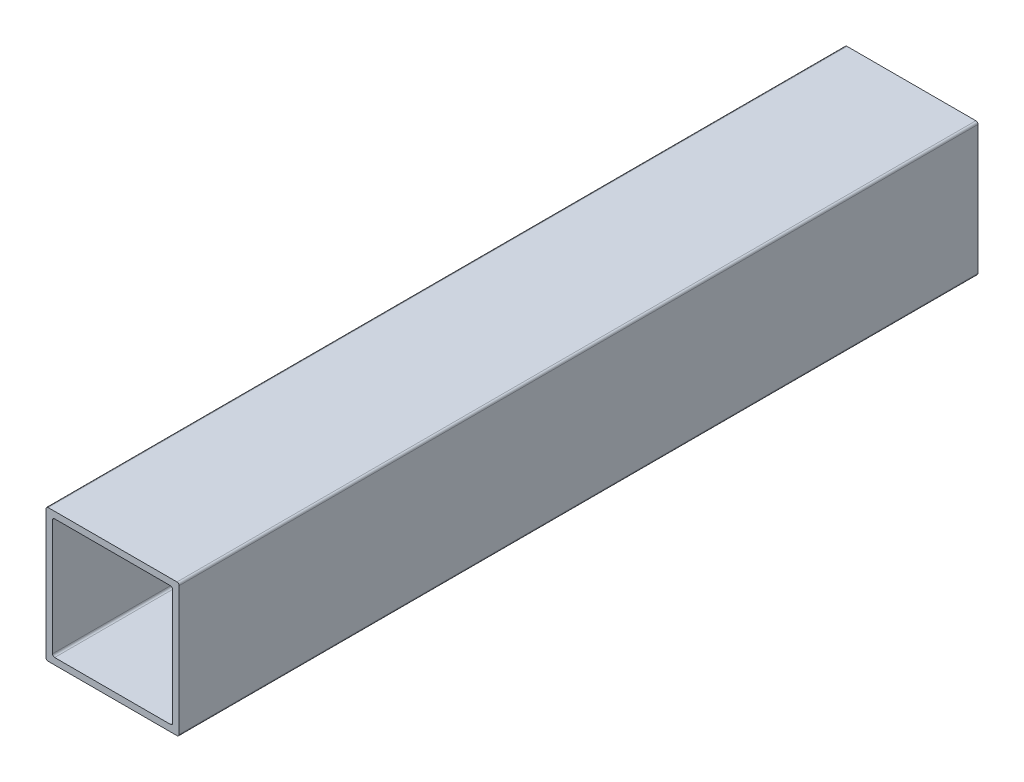
ISO-10303-21;
HEADER;
FILE_DESCRIPTION(('STEP AP214'),'2;1');
FILE_NAME('part.step','',(''),(''),'','','');
FILE_SCHEMA(('AUTOMOTIVE_DESIGN { 1 0 10303 214 1 1 1 1 }'));
ENDSEC;
DATA;
#1=APPLICATION_CONTEXT('core data for automotive mechanical design processes');
#2=APPLICATION_PROTOCOL_DEFINITION('international standard','automotive_design',2000,#1);
#3=PRODUCT_CONTEXT('',#1,'mechanical');
#4=PRODUCT('Part','Part','',(#3));
#5=PRODUCT_RELATED_PRODUCT_CATEGORY('part','',(#4));
#6=PRODUCT_DEFINITION_FORMATION('','',#4);
#7=PRODUCT_DEFINITION_CONTEXT('part definition',#1,'design');
#8=PRODUCT_DEFINITION('design','',#6,#7);
#9=PRODUCT_DEFINITION_SHAPE('','',#8);
#10=(LENGTH_UNIT() NAMED_UNIT(*) SI_UNIT(.MILLI.,.METRE.));
#11=(NAMED_UNIT(*) PLANE_ANGLE_UNIT() SI_UNIT($,.RADIAN.));
#12=(NAMED_UNIT(*) SI_UNIT($,.STERADIAN.) SOLID_ANGLE_UNIT());
#13=UNCERTAINTY_MEASURE_WITH_UNIT(LENGTH_MEASURE(1.E-05),#10,'distance_accuracy_value','');
#14=(GEOMETRIC_REPRESENTATION_CONTEXT(3) GLOBAL_UNCERTAINTY_ASSIGNED_CONTEXT((#13)) GLOBAL_UNIT_ASSIGNED_CONTEXT((#10,
#11,#12)) REPRESENTATION_CONTEXT('',''));
#15=CARTESIAN_POINT('',(0.,0.,0.));
#16=DIRECTION('',(0.,0.,1.));
#17=DIRECTION('',(1.,0.,0.));
#18=AXIS2_PLACEMENT_3D('',#15,#16,#17);
#19=CARTESIAN_POINT('',(0.,0.,-152.4));
#20=DIRECTION('',(-1.,0.,0.));
#21=DIRECTION('',(0.,0.,1.));
#22=AXIS2_PLACEMENT_3D('',#19,#20,#21);
#23=PLANE('',#22);
#24=DIRECTION('',(0.,-1.,0.));
#25=VECTOR('',#24,1.);
#26=CARTESIAN_POINT('',(0.,0.,-152.4));
#27=LINE('',#26,#25);
#28=CARTESIAN_POINT('',(0.,24.9936,-152.4));
#29=VERTEX_POINT('',#28);
#30=CARTESIAN_POINT('',(0.,0.4064,-152.4));
#31=VERTEX_POINT('',#30);
#32=EDGE_CURVE('E323',#29,#31,#27,.T.);
#33=ORIENTED_EDGE('',*,*,#32,.T.);
#34=DIRECTION('',(0.,0.,1.));
#35=VECTOR('',#34,1.);
#36=CARTESIAN_POINT('',(0.,0.4064,-152.4));
#37=LINE('',#36,#35);
#38=CARTESIAN_POINT('',(0.,0.4064,0.));
#39=VERTEX_POINT('',#38);
#40=EDGE_CURVE('E179',#31,#39,#37,.T.);
#41=ORIENTED_EDGE('',*,*,#40,.T.);
#42=DIRECTION('',(0.,-1.,0.));
#43=VECTOR('',#42,1.);
#44=CARTESIAN_POINT('',(0.,0.,0.));
#45=LINE('',#44,#43);
#46=CARTESIAN_POINT('',(0.,24.9936,0.));
#47=VERTEX_POINT('',#46);
#48=EDGE_CURVE('E162',#47,#39,#45,.T.);
#49=ORIENTED_EDGE('',*,*,#48,.F.);
#50=DIRECTION('',(0.,0.,1.));
#51=VECTOR('',#50,1.);
#52=CARTESIAN_POINT('',(0.,24.9936,-152.4));
#53=LINE('',#52,#51);
#54=EDGE_CURVE('E176',#47,#29,#53,.F.);
#55=ORIENTED_EDGE('',*,*,#54,.T.);
#56=EDGE_LOOP('',(#33,#41,#49,#55));
#57=FACE_BOUND('',#56,.T.);
#58=ADVANCED_FACE('F45',(#57),#23,.T.);
#59=CARTESIAN_POINT('',(0.,25.4,-152.4));
#60=DIRECTION('',(0.,1.,0.));
#61=DIRECTION('',(0.,0.,1.));
#62=AXIS2_PLACEMENT_3D('',#59,#60,#61);
#63=PLANE('',#62);
#64=DIRECTION('',(-1.,0.,0.));
#65=VECTOR('',#64,1.);
#66=CARTESIAN_POINT('',(0.,25.4,-152.4));
#67=LINE('',#66,#65);
#68=CARTESIAN_POINT('',(24.9936,25.4,-152.4));
#69=VERTEX_POINT('',#68);
#70=CARTESIAN_POINT('',(0.4064,25.4,-152.4));
#71=VERTEX_POINT('',#70);
#72=EDGE_CURVE('E188',#69,#71,#67,.T.);
#73=ORIENTED_EDGE('',*,*,#72,.T.);
#74=DIRECTION('',(0.,0.,1.));
#75=VECTOR('',#74,1.);
#76=CARTESIAN_POINT('',(0.4064,25.4,-152.4));
#77=LINE('',#76,#75);
#78=CARTESIAN_POINT('',(0.4064,25.4,0.));
#79=VERTEX_POINT('',#78);
#80=EDGE_CURVE('E234',#71,#79,#77,.T.);
#81=ORIENTED_EDGE('',*,*,#80,.T.);
#82=DIRECTION('',(-1.,0.,0.));
#83=VECTOR('',#82,1.);
#84=CARTESIAN_POINT('',(0.,25.4,0.));
#85=LINE('',#84,#83);
#86=CARTESIAN_POINT('',(24.9936,25.4,0.));
#87=VERTEX_POINT('',#86);
#88=EDGE_CURVE('E164',#87,#79,#85,.T.);
#89=ORIENTED_EDGE('',*,*,#88,.F.);
#90=DIRECTION('',(0.,0.,1.));
#91=VECTOR('',#90,1.);
#92=CARTESIAN_POINT('',(24.9936,25.4,-152.4));
#93=LINE('',#92,#91);
#94=EDGE_CURVE('E231',#87,#69,#93,.F.);
#95=ORIENTED_EDGE('',*,*,#94,.T.);
#96=EDGE_LOOP('',(#73,#81,#89,#95));
#97=FACE_BOUND('',#96,.T.);
#98=ADVANCED_FACE('F362',(#97),#63,.T.);
#99=CARTESIAN_POINT('',(25.4,0.,-152.4));
#100=DIRECTION('',(1.,0.,0.));
#101=DIRECTION('',(0.,0.,-1.));
#102=AXIS2_PLACEMENT_3D('',#99,#100,#101);
#103=PLANE('',#102);
#104=DIRECTION('',(0.,1.,0.));
#105=VECTOR('',#104,1.);
#106=CARTESIAN_POINT('',(25.4,0.,0.));
#107=LINE('',#106,#105);
#108=CARTESIAN_POINT('',(25.4,0.4064,0.));
#109=VERTEX_POINT('',#108);
#110=CARTESIAN_POINT('',(25.4,24.9936,0.));
#111=VERTEX_POINT('',#110);
#112=EDGE_CURVE('E335',#109,#111,#107,.T.);
#113=ORIENTED_EDGE('',*,*,#112,.F.);
#114=DIRECTION('',(0.,0.,1.));
#115=VECTOR('',#114,1.);
#116=CARTESIAN_POINT('',(25.4,0.4064,-152.4));
#117=LINE('',#116,#115);
#118=CARTESIAN_POINT('',(25.4,0.4064,-152.4));
#119=VERTEX_POINT('',#118);
#120=EDGE_CURVE('E228',#109,#119,#117,.F.);
#121=ORIENTED_EDGE('',*,*,#120,.T.);
#122=DIRECTION('',(0.,1.,0.));
#123=VECTOR('',#122,1.);
#124=CARTESIAN_POINT('',(25.4,0.,-152.4));
#125=LINE('',#124,#123);
#126=CARTESIAN_POINT('',(25.4,24.9936,-152.4));
#127=VERTEX_POINT('',#126);
#128=EDGE_CURVE('E194',#119,#127,#125,.T.);
#129=ORIENTED_EDGE('',*,*,#128,.T.);
#130=DIRECTION('',(0.,0.,1.));
#131=VECTOR('',#130,1.);
#132=CARTESIAN_POINT('',(25.4,24.9936,-152.4));
#133=LINE('',#132,#131);
#134=EDGE_CURVE('E224',#127,#111,#133,.T.);
#135=ORIENTED_EDGE('',*,*,#134,.T.);
#136=EDGE_LOOP('',(#113,#121,#129,#135));
#137=FACE_BOUND('',#136,.T.);
#138=ADVANCED_FACE('F342',(#137),#103,.T.);
#139=CARTESIAN_POINT('',(0.,0.,-152.4));
#140=DIRECTION('',(0.,-1.,0.));
#141=DIRECTION('',(0.,0.,-1.));
#142=AXIS2_PLACEMENT_3D('',#139,#140,#141);
#143=PLANE('',#142);
#144=DIRECTION('',(1.,0.,0.));
#145=VECTOR('',#144,1.);
#146=CARTESIAN_POINT('',(0.,0.,0.));
#147=LINE('',#146,#145);
#148=CARTESIAN_POINT('',(0.4064,0.,0.));
#149=VERTEX_POINT('',#148);
#150=CARTESIAN_POINT('',(24.9936,0.,0.));
#151=VERTEX_POINT('',#150);
#152=EDGE_CURVE('E181',#149,#151,#147,.T.);
#153=ORIENTED_EDGE('',*,*,#152,.F.);
#154=DIRECTION('',(0.,0.,1.));
#155=VECTOR('',#154,1.);
#156=CARTESIAN_POINT('',(0.4064,0.,-152.4));
#157=LINE('',#156,#155);
#158=CARTESIAN_POINT('',(0.4064,0.,-152.4));
#159=VERTEX_POINT('',#158);
#160=EDGE_CURVE('E210',#149,#159,#157,.F.);
#161=ORIENTED_EDGE('',*,*,#160,.T.);
#162=DIRECTION('',(1.,0.,0.));
#163=VECTOR('',#162,1.);
#164=CARTESIAN_POINT('',(0.,0.,-152.4));
#165=LINE('',#164,#163);
#166=CARTESIAN_POINT('',(24.9936,0.,-152.4));
#167=VERTEX_POINT('',#166);
#168=EDGE_CURVE('E326',#159,#167,#165,.T.);
#169=ORIENTED_EDGE('',*,*,#168,.T.);
#170=DIRECTION('',(0.,0.,1.));
#171=VECTOR('',#170,1.);
#172=CARTESIAN_POINT('',(24.9936,0.,-152.4));
#173=LINE('',#172,#171);
#174=EDGE_CURVE('E206',#167,#151,#173,.T.);
#175=ORIENTED_EDGE('',*,*,#174,.T.);
#176=EDGE_LOOP('',(#153,#161,#169,#175));
#177=FACE_BOUND('',#176,.T.);
#178=ADVANCED_FACE('F355',(#177),#143,.T.);
#179=CARTESIAN_POINT('',(0.,0.,-152.4));
#180=DIRECTION('',(0.,0.,-1.));
#181=DIRECTION('',(-1.,0.,0.));
#182=AXIS2_PLACEMENT_3D('',#179,#180,#181);
#183=PLANE('',#182);
#184=DIRECTION('',(-1.,0.,0.));
#185=VECTOR('',#184,1.);
#186=CARTESIAN_POINT('',(1.2446,24.1554,-152.4));
#187=LINE('',#186,#185);
#188=CARTESIAN_POINT('',(23.749,24.1554,-152.4));
#189=VERTEX_POINT('',#188);
#190=CARTESIAN_POINT('',(1.651,24.1554,-152.4));
#191=VERTEX_POINT('',#190);
#192=EDGE_CURVE('E182',#189,#191,#187,.T.);
#193=ORIENTED_EDGE('',*,*,#192,.T.);
#194=CARTESIAN_POINT('',(1.651,23.749,-152.4));
#195=DIRECTION('',(0.,0.,-1.));
#196=DIRECTION('',(-1.,0.,0.));
#197=AXIS2_PLACEMENT_3D('',#194,#195,#196);
#198=CIRCLE('',#197,0.4064);
#199=CARTESIAN_POINT('',(1.2446,23.749,-152.4));
#200=VERTEX_POINT('',#199);
#201=EDGE_CURVE('E267',#191,#200,#198,.F.);
#202=ORIENTED_EDGE('',*,*,#201,.T.);
#203=DIRECTION('',(0.,-1.,0.));
#204=VECTOR('',#203,1.);
#205=CARTESIAN_POINT('',(1.2446,1.2446,-152.4));
#206=LINE('',#205,#204);
#207=CARTESIAN_POINT('',(1.2446,1.651,-152.4));
#208=VERTEX_POINT('',#207);
#209=EDGE_CURVE('E302',#200,#208,#206,.T.);
#210=ORIENTED_EDGE('',*,*,#209,.T.);
#211=CARTESIAN_POINT('',(1.651,1.651,-152.4));
#212=DIRECTION('',(0.,0.,-1.));
#213=DIRECTION('',(-1.,0.,0.));
#214=AXIS2_PLACEMENT_3D('',#211,#212,#213);
#215=CIRCLE('',#214,0.4064);
#216=CARTESIAN_POINT('',(1.651,1.2446,-152.4));
#217=VERTEX_POINT('',#216);
#218=EDGE_CURVE('E11',#208,#217,#215,.F.);
#219=ORIENTED_EDGE('',*,*,#218,.T.);
#220=DIRECTION('',(1.,0.,0.));
#221=VECTOR('',#220,1.);
#222=CARTESIAN_POINT('',(1.2446,1.2446,-152.4));
#223=LINE('',#222,#221);
#224=CARTESIAN_POINT('',(23.749,1.2446,-152.4));
#225=VERTEX_POINT('',#224);
#226=EDGE_CURVE('E298',#217,#225,#223,.T.);
#227=ORIENTED_EDGE('',*,*,#226,.T.);
#228=CARTESIAN_POINT('',(23.749,1.651,-152.4));
#229=DIRECTION('',(0.,0.,-1.));
#230=DIRECTION('',(-1.,0.,0.));
#231=AXIS2_PLACEMENT_3D('',#228,#229,#230);
#232=CIRCLE('',#231,0.4064);
#233=CARTESIAN_POINT('',(24.1554,1.651,-152.4));
#234=VERTEX_POINT('',#233);
#235=EDGE_CURVE('E279',#225,#234,#232,.F.);
#236=ORIENTED_EDGE('',*,*,#235,.T.);
#237=DIRECTION('',(0.,1.,0.));
#238=VECTOR('',#237,1.);
#239=CARTESIAN_POINT('',(24.1554,1.2446,-152.4));
#240=LINE('',#239,#238);
#241=CARTESIAN_POINT('',(24.1554,23.749,-152.4));
#242=VERTEX_POINT('',#241);
#243=EDGE_CURVE('E301',#234,#242,#240,.T.);
#244=ORIENTED_EDGE('',*,*,#243,.T.);
#245=CARTESIAN_POINT('',(23.749,23.749,-152.4));
#246=DIRECTION('',(0.,0.,-1.));
#247=DIRECTION('',(-1.,0.,0.));
#248=AXIS2_PLACEMENT_3D('',#245,#246,#247);
#249=CIRCLE('',#248,0.4064);
#250=EDGE_CURVE('E273',#242,#189,#249,.F.);
#251=ORIENTED_EDGE('',*,*,#250,.T.);
#252=EDGE_LOOP('',(#193,#202,#210,#219,#227,#236,#244,#251));
#253=FACE_BOUND('',#252,.T.);
#254=ORIENTED_EDGE('',*,*,#168,.F.);
#255=CARTESIAN_POINT('',(0.4064,0.4064,-152.4));
#256=DIRECTION('',(0.,0.,-1.));
#257=DIRECTION('',(-1.,0.,0.));
#258=AXIS2_PLACEMENT_3D('',#255,#256,#257);
#259=CIRCLE('',#258,0.4064);
#260=EDGE_CURVE('E221',#159,#31,#259,.T.);
#261=ORIENTED_EDGE('',*,*,#260,.T.);
#262=ORIENTED_EDGE('',*,*,#32,.F.);
#263=CARTESIAN_POINT('',(0.4064,24.9936,-152.4));
#264=DIRECTION('',(0.,0.,-1.));
#265=DIRECTION('',(-1.,0.,0.));
#266=AXIS2_PLACEMENT_3D('',#263,#264,#265);
#267=CIRCLE('',#266,0.4064);
#268=EDGE_CURVE('E186',#29,#71,#267,.T.);
#269=ORIENTED_EDGE('',*,*,#268,.T.);
#270=ORIENTED_EDGE('',*,*,#72,.F.);
#271=CARTESIAN_POINT('',(24.9936,24.9936,-152.4));
#272=DIRECTION('',(0.,0.,-1.));
#273=DIRECTION('',(-1.,0.,0.));
#274=AXIS2_PLACEMENT_3D('',#271,#272,#273);
#275=CIRCLE('',#274,0.4064);
#276=EDGE_CURVE('E213',#69,#127,#275,.T.);
#277=ORIENTED_EDGE('',*,*,#276,.T.);
#278=ORIENTED_EDGE('',*,*,#128,.F.);
#279=CARTESIAN_POINT('',(24.9936,0.4064,-152.4));
#280=DIRECTION('',(0.,0.,-1.));
#281=DIRECTION('',(-1.,0.,0.));
#282=AXIS2_PLACEMENT_3D('',#279,#280,#281);
#283=CIRCLE('',#282,0.4064);
#284=EDGE_CURVE('E218',#119,#167,#283,.T.);
#285=ORIENTED_EDGE('',*,*,#284,.T.);
#286=EDGE_LOOP('',(#254,#261,#262,#269,#270,#277,#278,#285));
#287=FACE_BOUND('',#286,.T.);
#288=ADVANCED_FACE('F351',(#253,#287),#183,.T.);
#289=CARTESIAN_POINT('',(0.,0.,0.));
#290=DIRECTION('',(0.,0.,-1.));
#291=DIRECTION('',(-1.,0.,0.));
#292=AXIS2_PLACEMENT_3D('',#289,#290,#291);
#293=PLANE('',#292);
#294=DIRECTION('',(1.,0.,0.));
#295=VECTOR('',#294,1.);
#296=CARTESIAN_POINT('',(1.2446,1.2446,0.));
#297=LINE('',#296,#295);
#298=CARTESIAN_POINT('',(1.651,1.2446,0.));
#299=VERTEX_POINT('',#298);
#300=CARTESIAN_POINT('',(23.749,1.2446,0.));
#301=VERTEX_POINT('',#300);
#302=EDGE_CURVE('E287',#299,#301,#297,.T.);
#303=ORIENTED_EDGE('',*,*,#302,.F.);
#304=CARTESIAN_POINT('',(1.651,1.651,0.));
#305=DIRECTION('',(0.,0.,-1.));
#306=DIRECTION('',(-1.,0.,0.));
#307=AXIS2_PLACEMENT_3D('',#304,#305,#306);
#308=CIRCLE('',#307,0.4064);
#309=CARTESIAN_POINT('',(1.2446,1.651,0.));
#310=VERTEX_POINT('',#309);
#311=EDGE_CURVE('E54',#299,#310,#308,.T.);
#312=ORIENTED_EDGE('',*,*,#311,.T.);
#313=DIRECTION('',(0.,-1.,0.));
#314=VECTOR('',#313,1.);
#315=CARTESIAN_POINT('',(1.2446,1.2446,0.));
#316=LINE('',#315,#314);
#317=CARTESIAN_POINT('',(1.2446,23.749,0.));
#318=VERTEX_POINT('',#317);
#319=EDGE_CURVE('E286',#318,#310,#316,.T.);
#320=ORIENTED_EDGE('',*,*,#319,.F.);
#321=CARTESIAN_POINT('',(1.651,23.749,0.));
#322=DIRECTION('',(0.,0.,-1.));
#323=DIRECTION('',(-1.,0.,0.));
#324=AXIS2_PLACEMENT_3D('',#321,#322,#323);
#325=CIRCLE('',#324,0.4064);
#326=CARTESIAN_POINT('',(1.651,24.1554,0.));
#327=VERTEX_POINT('',#326);
#328=EDGE_CURVE('E264',#318,#327,#325,.T.);
#329=ORIENTED_EDGE('',*,*,#328,.T.);
#330=DIRECTION('',(-1.,0.,0.));
#331=VECTOR('',#330,1.);
#332=CARTESIAN_POINT('',(1.2446,24.1554,0.));
#333=LINE('',#332,#331);
#334=CARTESIAN_POINT('',(23.749,24.1554,0.));
#335=VERTEX_POINT('',#334);
#336=EDGE_CURVE('E308',#335,#327,#333,.T.);
#337=ORIENTED_EDGE('',*,*,#336,.F.);
#338=CARTESIAN_POINT('',(23.749,23.749,0.));
#339=DIRECTION('',(0.,0.,-1.));
#340=DIRECTION('',(-1.,0.,0.));
#341=AXIS2_PLACEMENT_3D('',#338,#339,#340);
#342=CIRCLE('',#341,0.4064);
#343=CARTESIAN_POINT('',(24.1554,23.749,0.));
#344=VERTEX_POINT('',#343);
#345=EDGE_CURVE('E270',#335,#344,#342,.T.);
#346=ORIENTED_EDGE('',*,*,#345,.T.);
#347=DIRECTION('',(0.,1.,0.));
#348=VECTOR('',#347,1.);
#349=CARTESIAN_POINT('',(24.1554,1.2446,0.));
#350=LINE('',#349,#348);
#351=CARTESIAN_POINT('',(24.1554,1.651,0.));
#352=VERTEX_POINT('',#351);
#353=EDGE_CURVE('E316',#352,#344,#350,.T.);
#354=ORIENTED_EDGE('',*,*,#353,.F.);
#355=CARTESIAN_POINT('',(23.749,1.651,0.));
#356=DIRECTION('',(0.,0.,-1.));
#357=DIRECTION('',(-1.,0.,0.));
#358=AXIS2_PLACEMENT_3D('',#355,#356,#357);
#359=CIRCLE('',#358,0.4064);
#360=EDGE_CURVE('E276',#352,#301,#359,.T.);
#361=ORIENTED_EDGE('',*,*,#360,.T.);
#362=EDGE_LOOP('',(#303,#312,#320,#329,#337,#346,#354,#361));
#363=FACE_BOUND('',#362,.T.);
#364=ORIENTED_EDGE('',*,*,#48,.T.);
#365=CARTESIAN_POINT('',(0.4064,0.4064,0.));
#366=DIRECTION('',(0.,0.,-1.));
#367=DIRECTION('',(-1.,0.,0.));
#368=AXIS2_PLACEMENT_3D('',#365,#366,#367);
#369=CIRCLE('',#368,0.4064);
#370=EDGE_CURVE('E203',#39,#149,#369,.F.);
#371=ORIENTED_EDGE('',*,*,#370,.T.);
#372=ORIENTED_EDGE('',*,*,#152,.T.);
#373=CARTESIAN_POINT('',(24.9936,0.4064,0.));
#374=DIRECTION('',(0.,0.,-1.));
#375=DIRECTION('',(-1.,0.,0.));
#376=AXIS2_PLACEMENT_3D('',#373,#374,#375);
#377=CIRCLE('',#376,0.4064);
#378=EDGE_CURVE('E170',#151,#109,#377,.F.);
#379=ORIENTED_EDGE('',*,*,#378,.T.);
#380=ORIENTED_EDGE('',*,*,#112,.T.);
#381=CARTESIAN_POINT('',(24.9936,24.9936,0.));
#382=DIRECTION('',(0.,0.,-1.));
#383=DIRECTION('',(-1.,0.,0.));
#384=AXIS2_PLACEMENT_3D('',#381,#382,#383);
#385=CIRCLE('',#384,0.4064);
#386=EDGE_CURVE('E171',#111,#87,#385,.F.);
#387=ORIENTED_EDGE('',*,*,#386,.T.);
#388=ORIENTED_EDGE('',*,*,#88,.T.);
#389=CARTESIAN_POINT('',(0.4064,24.9936,0.));
#390=DIRECTION('',(0.,0.,-1.));
#391=DIRECTION('',(-1.,0.,0.));
#392=AXIS2_PLACEMENT_3D('',#389,#390,#391);
#393=CIRCLE('',#392,0.4064);
#394=EDGE_CURVE('E159',#79,#47,#393,.F.);
#395=ORIENTED_EDGE('',*,*,#394,.T.);
#396=EDGE_LOOP('',(#364,#371,#372,#379,#380,#387,#388,#395));
#397=FACE_BOUND('',#396,.T.);
#398=ADVANCED_FACE('F161',(#363,#397),#293,.F.);
#399=CARTESIAN_POINT('',(1.2446,1.2446,-152.4));
#400=DIRECTION('',(-1.,0.,0.));
#401=DIRECTION('',(0.,-1.,0.));
#402=AXIS2_PLACEMENT_3D('',#399,#400,#401);
#403=PLANE('',#402);
#404=ORIENTED_EDGE('',*,*,#209,.F.);
#405=DIRECTION('',(0.,0.,1.));
#406=VECTOR('',#405,1.);
#407=CARTESIAN_POINT('',(1.2446,23.749,0.));
#408=LINE('',#407,#406);
#409=EDGE_CURVE('E240',#200,#318,#408,.T.);
#410=ORIENTED_EDGE('',*,*,#409,.T.);
#411=ORIENTED_EDGE('',*,*,#319,.T.);
#412=DIRECTION('',(0.,0.,1.));
#413=VECTOR('',#412,1.);
#414=CARTESIAN_POINT('',(1.2446,1.651,-152.4));
#415=LINE('',#414,#413);
#416=EDGE_CURVE('E237',#310,#208,#415,.F.);
#417=ORIENTED_EDGE('',*,*,#416,.T.);
#418=EDGE_LOOP('',(#404,#410,#411,#417));
#419=FACE_BOUND('',#418,.T.);
#420=ADVANCED_FACE('F293',(#419),#403,.F.);
#421=CARTESIAN_POINT('',(1.2446,24.1554,-152.4));
#422=DIRECTION('',(0.,1.,0.));
#423=DIRECTION('',(0.,0.,1.));
#424=AXIS2_PLACEMENT_3D('',#421,#422,#423);
#425=PLANE('',#424);
#426=ORIENTED_EDGE('',*,*,#336,.T.);
#427=DIRECTION('',(0.,0.,1.));
#428=VECTOR('',#427,1.);
#429=CARTESIAN_POINT('',(1.651,24.1554,-152.4));
#430=LINE('',#429,#428);
#431=EDGE_CURVE('E248',#327,#191,#430,.F.);
#432=ORIENTED_EDGE('',*,*,#431,.T.);
#433=ORIENTED_EDGE('',*,*,#192,.F.);
#434=DIRECTION('',(0.,0.,1.));
#435=VECTOR('',#434,1.);
#436=CARTESIAN_POINT('',(23.749,24.1554,0.));
#437=LINE('',#436,#435);
#438=EDGE_CURVE('E244',#189,#335,#437,.T.);
#439=ORIENTED_EDGE('',*,*,#438,.T.);
#440=EDGE_LOOP('',(#426,#432,#433,#439));
#441=FACE_BOUND('',#440,.T.);
#442=ADVANCED_FACE('F451',(#441),#425,.F.);
#443=CARTESIAN_POINT('',(24.1554,1.2446,-152.4));
#444=DIRECTION('',(1.,0.,0.));
#445=DIRECTION('',(0.,0.,-1.));
#446=AXIS2_PLACEMENT_3D('',#443,#444,#445);
#447=PLANE('',#446);
#448=ORIENTED_EDGE('',*,*,#353,.T.);
#449=DIRECTION('',(0.,0.,1.));
#450=VECTOR('',#449,1.);
#451=CARTESIAN_POINT('',(24.1554,23.749,-152.4));
#452=LINE('',#451,#450);
#453=EDGE_CURVE('E255',#344,#242,#452,.F.);
#454=ORIENTED_EDGE('',*,*,#453,.T.);
#455=ORIENTED_EDGE('',*,*,#243,.F.);
#456=DIRECTION('',(0.,0.,1.));
#457=VECTOR('',#456,1.);
#458=CARTESIAN_POINT('',(24.1554,1.651,0.));
#459=LINE('',#458,#457);
#460=EDGE_CURVE('E251',#234,#352,#459,.T.);
#461=ORIENTED_EDGE('',*,*,#460,.T.);
#462=EDGE_LOOP('',(#448,#454,#455,#461));
#463=FACE_BOUND('',#462,.T.);
#464=ADVANCED_FACE('F444',(#463),#447,.F.);
#465=CARTESIAN_POINT('',(1.2446,1.2446,-152.4));
#466=DIRECTION('',(0.,-1.,0.));
#467=DIRECTION('',(0.,0.,-1.));
#468=AXIS2_PLACEMENT_3D('',#465,#466,#467);
#469=PLANE('',#468);
#470=ORIENTED_EDGE('',*,*,#302,.T.);
#471=DIRECTION('',(0.,0.,1.));
#472=VECTOR('',#471,1.);
#473=CARTESIAN_POINT('',(23.749,1.2446,-152.4));
#474=LINE('',#473,#472);
#475=EDGE_CURVE('E61',#301,#225,#474,.F.);
#476=ORIENTED_EDGE('',*,*,#475,.T.);
#477=ORIENTED_EDGE('',*,*,#226,.F.);
#478=DIRECTION('',(0.,0.,1.));
#479=VECTOR('',#478,1.);
#480=CARTESIAN_POINT('',(1.651,1.2446,0.));
#481=LINE('',#480,#479);
#482=EDGE_CURVE('E258',#217,#299,#481,.T.);
#483=ORIENTED_EDGE('',*,*,#482,.T.);
#484=EDGE_LOOP('',(#470,#476,#477,#483));
#485=FACE_BOUND('',#484,.T.);
#486=ADVANCED_FACE('F297',(#485),#469,.F.);
#487=CARTESIAN_POINT('',(0.4064,0.4064,-152.4));
#488=DIRECTION('',(0.,0.,1.));
#489=DIRECTION('',(1.,0.,0.));
#490=AXIS2_PLACEMENT_3D('',#487,#488,#489);
#491=CYLINDRICAL_SURFACE('',#490,0.4064);
#492=ORIENTED_EDGE('',*,*,#260,.F.);
#493=ORIENTED_EDGE('',*,*,#160,.F.);
#494=ORIENTED_EDGE('',*,*,#370,.F.);
#495=ORIENTED_EDGE('',*,*,#40,.F.);
#496=EDGE_LOOP('',(#492,#493,#494,#495));
#497=FACE_BOUND('',#496,.T.);
#498=ADVANCED_FACE('F358',(#497),#491,.T.);
#499=CARTESIAN_POINT('',(24.9936,0.4064,-152.4));
#500=DIRECTION('',(0.,0.,1.));
#501=DIRECTION('',(1.,0.,0.));
#502=AXIS2_PLACEMENT_3D('',#499,#500,#501);
#503=CYLINDRICAL_SURFACE('',#502,0.4064);
#504=ORIENTED_EDGE('',*,*,#284,.F.);
#505=ORIENTED_EDGE('',*,*,#120,.F.);
#506=ORIENTED_EDGE('',*,*,#378,.F.);
#507=ORIENTED_EDGE('',*,*,#174,.F.);
#508=EDGE_LOOP('',(#504,#505,#506,#507));
#509=FACE_BOUND('',#508,.T.);
#510=ADVANCED_FACE('F347',(#509),#503,.T.);
#511=CARTESIAN_POINT('',(0.4064,24.9936,-152.4));
#512=DIRECTION('',(0.,0.,1.));
#513=DIRECTION('',(1.,0.,0.));
#514=AXIS2_PLACEMENT_3D('',#511,#512,#513);
#515=CYLINDRICAL_SURFACE('',#514,0.4064);
#516=ORIENTED_EDGE('',*,*,#268,.F.);
#517=ORIENTED_EDGE('',*,*,#54,.F.);
#518=ORIENTED_EDGE('',*,*,#394,.F.);
#519=ORIENTED_EDGE('',*,*,#80,.F.);
#520=EDGE_LOOP('',(#516,#517,#518,#519));
#521=FACE_BOUND('',#520,.T.);
#522=ADVANCED_FACE('F185',(#521),#515,.T.);
#523=CARTESIAN_POINT('',(24.9936,24.9936,-152.4));
#524=DIRECTION('',(0.,0.,1.));
#525=DIRECTION('',(1.,0.,0.));
#526=AXIS2_PLACEMENT_3D('',#523,#524,#525);
#527=CYLINDRICAL_SURFACE('',#526,0.4064);
#528=ORIENTED_EDGE('',*,*,#276,.F.);
#529=ORIENTED_EDGE('',*,*,#94,.F.);
#530=ORIENTED_EDGE('',*,*,#386,.F.);
#531=ORIENTED_EDGE('',*,*,#134,.F.);
#532=EDGE_LOOP('',(#528,#529,#530,#531));
#533=FACE_BOUND('',#532,.T.);
#534=ADVANCED_FACE('F365',(#533),#527,.T.);
#535=CARTESIAN_POINT('',(1.651,23.749,-152.4));
#536=DIRECTION('',(0.,0.,-1.));
#537=DIRECTION('',(-1.,0.,0.));
#538=AXIS2_PLACEMENT_3D('',#535,#536,#537);
#539=CYLINDRICAL_SURFACE('',#538,0.4064);
#540=ORIENTED_EDGE('',*,*,#201,.F.);
#541=ORIENTED_EDGE('',*,*,#431,.F.);
#542=ORIENTED_EDGE('',*,*,#328,.F.);
#543=ORIENTED_EDGE('',*,*,#409,.F.);
#544=EDGE_LOOP('',(#540,#541,#542,#543));
#545=FACE_BOUND('',#544,.T.);
#546=ADVANCED_FACE('F367',(#545),#539,.F.);
#547=CARTESIAN_POINT('',(23.749,23.749,-152.4));
#548=DIRECTION('',(0.,0.,-1.));
#549=DIRECTION('',(-1.,0.,0.));
#550=AXIS2_PLACEMENT_3D('',#547,#548,#549);
#551=CYLINDRICAL_SURFACE('',#550,0.4064);
#552=ORIENTED_EDGE('',*,*,#250,.F.);
#553=ORIENTED_EDGE('',*,*,#453,.F.);
#554=ORIENTED_EDGE('',*,*,#345,.F.);
#555=ORIENTED_EDGE('',*,*,#438,.F.);
#556=EDGE_LOOP('',(#552,#553,#554,#555));
#557=FACE_BOUND('',#556,.T.);
#558=ADVANCED_FACE('F374',(#557),#551,.F.);
#559=CARTESIAN_POINT('',(23.749,1.651,-152.4));
#560=DIRECTION('',(0.,0.,-1.));
#561=DIRECTION('',(-1.,0.,0.));
#562=AXIS2_PLACEMENT_3D('',#559,#560,#561);
#563=CYLINDRICAL_SURFACE('',#562,0.4064);
#564=ORIENTED_EDGE('',*,*,#235,.F.);
#565=ORIENTED_EDGE('',*,*,#475,.F.);
#566=ORIENTED_EDGE('',*,*,#360,.F.);
#567=ORIENTED_EDGE('',*,*,#460,.F.);
#568=EDGE_LOOP('',(#564,#565,#566,#567));
#569=FACE_BOUND('',#568,.T.);
#570=ADVANCED_FACE('F421',(#569),#563,.F.);
#571=CARTESIAN_POINT('',(1.651,1.651,-152.4));
#572=DIRECTION('',(0.,0.,-1.));
#573=DIRECTION('',(-1.,0.,0.));
#574=AXIS2_PLACEMENT_3D('',#571,#572,#573);
#575=CYLINDRICAL_SURFACE('',#574,0.4064);
#576=ORIENTED_EDGE('',*,*,#218,.F.);
#577=ORIENTED_EDGE('',*,*,#416,.F.);
#578=ORIENTED_EDGE('',*,*,#311,.F.);
#579=ORIENTED_EDGE('',*,*,#482,.F.);
#580=EDGE_LOOP('',(#576,#577,#578,#579));
#581=FACE_BOUND('',#580,.T.);
#582=ADVANCED_FACE('F47',(#581),#575,.F.);
#583=CLOSED_SHELL('',(#58,#98,#138,#178,#288,#398,#420,#442,#464,#486,#498,#510,#522,#534,#546,
#558,#570,#582));
#584=MANIFOLD_SOLID_BREP('B2',#583);
#585=ADVANCED_BREP_SHAPE_REPRESENTATION('',(#18,#584),#14);
#586=SHAPE_DEFINITION_REPRESENTATION(#9,#585);
ENDSEC;
END-ISO-10303-21;
